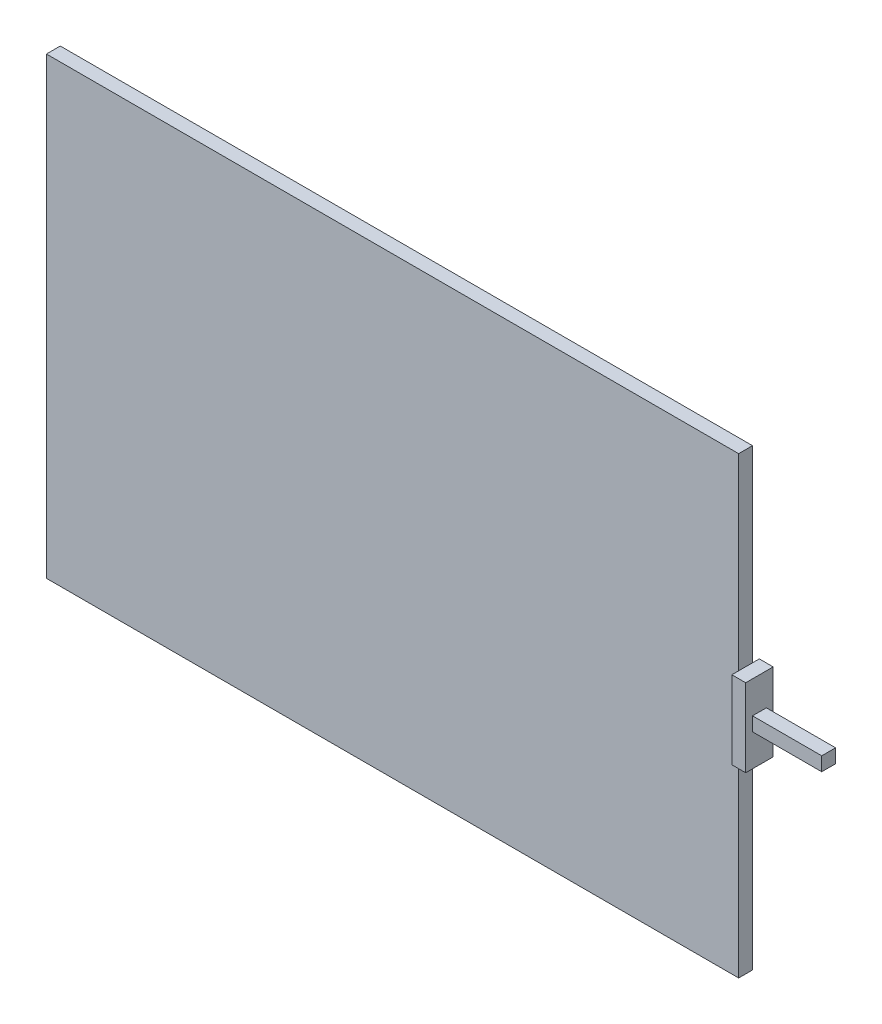
ISO-10303-21;
HEADER;
FILE_DESCRIPTION(('STEP AP214'),'2;1');
FILE_NAME('part.step','',(''),(''),'','','');
FILE_SCHEMA(('AUTOMOTIVE_DESIGN { 1 0 10303 214 1 1 1 1 }'));
ENDSEC;
DATA;
#1=APPLICATION_CONTEXT('core data for automotive mechanical design processes');
#2=APPLICATION_PROTOCOL_DEFINITION('international standard','automotive_design',2000,#1);
#3=PRODUCT_CONTEXT('',#1,'mechanical');
#4=PRODUCT('Part','Part','',(#3));
#5=PRODUCT_RELATED_PRODUCT_CATEGORY('part','',(#4));
#6=PRODUCT_DEFINITION_FORMATION('','',#4);
#7=PRODUCT_DEFINITION_CONTEXT('part definition',#1,'design');
#8=PRODUCT_DEFINITION('design','',#6,#7);
#9=PRODUCT_DEFINITION_SHAPE('','',#8);
#10=(LENGTH_UNIT() NAMED_UNIT(*) SI_UNIT(.MILLI.,.METRE.));
#11=(NAMED_UNIT(*) PLANE_ANGLE_UNIT() SI_UNIT($,.RADIAN.));
#12=(NAMED_UNIT(*) SI_UNIT($,.STERADIAN.) SOLID_ANGLE_UNIT());
#13=UNCERTAINTY_MEASURE_WITH_UNIT(LENGTH_MEASURE(1.E-05),#10,'distance_accuracy_value','');
#14=(GEOMETRIC_REPRESENTATION_CONTEXT(3) GLOBAL_UNCERTAINTY_ASSIGNED_CONTEXT((#13)) GLOBAL_UNIT_ASSIGNED_CONTEXT((#10,
#11,#12)) REPRESENTATION_CONTEXT('',''));
#15=CARTESIAN_POINT('',(0.,0.,0.));
#16=DIRECTION('',(0.,0.,1.));
#17=DIRECTION('',(1.,0.,0.));
#18=AXIS2_PLACEMENT_3D('',#15,#16,#17);
#19=CARTESIAN_POINT('',(50.0000000000003,32.7999999999999,2.));
#20=DIRECTION('',(1.,0.,0.));
#21=DIRECTION('',(0.,1.,0.));
#22=AXIS2_PLACEMENT_3D('',#19,#20,#21);
#23=PLANE('',#22);
#24=DIRECTION('',(0.,0.,-1.));
#25=VECTOR('',#24,1.);
#26=CARTESIAN_POINT('',(50.0000000000003,-5.63072724859682,2.98414402009177));
#27=LINE('',#26,#25);
#28=CARTESIAN_POINT('',(50.0000000000003,-5.63072724859681,2.));
#29=VERTEX_POINT('',#28);
#30=CARTESIAN_POINT('',(50.0000000000003,-5.63072724859681,0.));
#31=VERTEX_POINT('',#30);
#32=EDGE_CURVE('E11',#29,#31,#27,.T.);
#33=ORIENTED_EDGE('',*,*,#32,.F.);
#34=DIRECTION('',(0.,-1.,0.));
#35=VECTOR('',#34,1.);
#36=CARTESIAN_POINT('',(50.0000000000003,32.7999999999999,2.));
#37=LINE('',#36,#35);
#38=CARTESIAN_POINT('',(50.0000000000003,-32.7999999999999,2.));
#39=VERTEX_POINT('',#38);
#40=EDGE_CURVE('E201',#29,#39,#37,.T.);
#41=ORIENTED_EDGE('',*,*,#40,.T.);
#42=DIRECTION('',(0.,0.,-1.));
#43=VECTOR('',#42,1.);
#44=CARTESIAN_POINT('',(50.0000000000003,-32.7999999999999,2.));
#45=LINE('',#44,#43);
#46=CARTESIAN_POINT('',(50.0000000000003,-32.7999999999999,0.));
#47=VERTEX_POINT('',#46);
#48=EDGE_CURVE('E40',#39,#47,#45,.T.);
#49=ORIENTED_EDGE('',*,*,#48,.T.);
#50=DIRECTION('',(0.,-1.,0.));
#51=VECTOR('',#50,1.);
#52=CARTESIAN_POINT('',(50.0000000000003,32.7999999999999,0.));
#53=LINE('',#52,#51);
#54=EDGE_CURVE('E214',#31,#47,#53,.T.);
#55=ORIENTED_EDGE('',*,*,#54,.F.);
#56=EDGE_LOOP('',(#33,#41,#49,#55));
#57=FACE_BOUND('',#56,.T.);
#58=ADVANCED_FACE('F36',(#57),#23,.T.);
#59=CARTESIAN_POINT('',(-49.9999999999997,-32.7999999999999,2.));
#60=DIRECTION('',(0.,1.,0.));
#61=DIRECTION('',(0.,0.,1.));
#62=AXIS2_PLACEMENT_3D('',#59,#60,#61);
#63=PLANE('',#62);
#64=DIRECTION('',(1.,0.,0.));
#65=VECTOR('',#64,1.);
#66=CARTESIAN_POINT('',(-49.9999999999997,-32.7999999999999,0.));
#67=LINE('',#66,#65);
#68=CARTESIAN_POINT('',(-49.9999999999997,-32.7999999999999,0.));
#69=VERTEX_POINT('',#68);
#70=EDGE_CURVE('E197',#69,#47,#67,.T.);
#71=ORIENTED_EDGE('',*,*,#70,.T.);
#72=ORIENTED_EDGE('',*,*,#48,.F.);
#73=DIRECTION('',(1.,0.,0.));
#74=VECTOR('',#73,1.);
#75=CARTESIAN_POINT('',(-49.9999999999997,-32.7999999999999,2.));
#76=LINE('',#75,#74);
#77=CARTESIAN_POINT('',(-49.9999999999997,-32.7999999999999,2.));
#78=VERTEX_POINT('',#77);
#79=EDGE_CURVE('E198',#78,#39,#76,.T.);
#80=ORIENTED_EDGE('',*,*,#79,.F.);
#81=DIRECTION('',(0.,0.,-1.));
#82=VECTOR('',#81,1.);
#83=CARTESIAN_POINT('',(-49.9999999999997,-32.7999999999999,2.));
#84=LINE('',#83,#82);
#85=EDGE_CURVE('E211',#78,#69,#84,.T.);
#86=ORIENTED_EDGE('',*,*,#85,.T.);
#87=EDGE_LOOP('',(#71,#72,#80,#86));
#88=FACE_BOUND('',#87,.T.);
#89=ADVANCED_FACE('F38',(#88),#63,.F.);
#90=DIRECTION('',(0.,0.,1.));
#91=VECTOR('',#90,1.);
#92=CARTESIAN_POINT('',(50.0000000000003,5.63072724859684,2.98414402009177));
#93=LINE('',#92,#91);
#94=CARTESIAN_POINT('',(50.0000000000003,5.63072724859685,0.));
#95=VERTEX_POINT('',#94);
#96=CARTESIAN_POINT('',(50.0000000000003,5.63072724859684,2.));
#97=VERTEX_POINT('',#96);
#98=EDGE_CURVE('E45',#95,#97,#93,.T.);
#99=ORIENTED_EDGE('',*,*,#98,.F.);
#100=CARTESIAN_POINT('',(50.0000000000003,32.7999999999999,0.));
#101=VERTEX_POINT('',#100);
#102=EDGE_CURVE('E215',#101,#95,#53,.T.);
#103=ORIENTED_EDGE('',*,*,#102,.F.);
#104=DIRECTION('',(0.,0.,-1.));
#105=VECTOR('',#104,1.);
#106=CARTESIAN_POINT('',(50.0000000000003,32.7999999999999,2.));
#107=LINE('',#106,#105);
#108=CARTESIAN_POINT('',(50.0000000000003,32.7999999999999,2.));
#109=VERTEX_POINT('',#108);
#110=EDGE_CURVE('E226',#109,#101,#107,.T.);
#111=ORIENTED_EDGE('',*,*,#110,.F.);
#112=EDGE_CURVE('E203',#109,#97,#37,.T.);
#113=ORIENTED_EDGE('',*,*,#112,.T.);
#114=EDGE_LOOP('',(#99,#103,#111,#113));
#115=FACE_BOUND('',#114,.T.);
#116=ADVANCED_FACE('F281',(#115),#23,.T.);
#117=CARTESIAN_POINT('',(-49.9999999999997,32.7999999999999,2.));
#118=DIRECTION('',(0.,1.,0.));
#119=DIRECTION('',(0.,0.,1.));
#120=AXIS2_PLACEMENT_3D('',#117,#118,#119);
#121=PLANE('',#120);
#122=DIRECTION('',(1.,0.,0.));
#123=VECTOR('',#122,1.);
#124=CARTESIAN_POINT('',(-49.9999999999997,32.7999999999999,0.));
#125=LINE('',#124,#123);
#126=CARTESIAN_POINT('',(-49.9999999999997,32.7999999999999,0.));
#127=VERTEX_POINT('',#126);
#128=EDGE_CURVE('E218',#127,#101,#125,.T.);
#129=ORIENTED_EDGE('',*,*,#128,.F.);
#130=DIRECTION('',(0.,0.,-1.));
#131=VECTOR('',#130,1.);
#132=CARTESIAN_POINT('',(-49.9999999999997,32.7999999999999,2.));
#133=LINE('',#132,#131);
#134=CARTESIAN_POINT('',(-49.9999999999997,32.7999999999999,2.));
#135=VERTEX_POINT('',#134);
#136=EDGE_CURVE('E225',#135,#127,#133,.T.);
#137=ORIENTED_EDGE('',*,*,#136,.F.);
#138=DIRECTION('',(1.,0.,0.));
#139=VECTOR('',#138,1.);
#140=CARTESIAN_POINT('',(-49.9999999999997,32.7999999999999,2.));
#141=LINE('',#140,#139);
#142=EDGE_CURVE('E205',#135,#109,#141,.T.);
#143=ORIENTED_EDGE('',*,*,#142,.T.);
#144=ORIENTED_EDGE('',*,*,#110,.T.);
#145=EDGE_LOOP('',(#129,#137,#143,#144));
#146=FACE_BOUND('',#145,.T.);
#147=ADVANCED_FACE('F279',(#146),#121,.T.);
#148=CARTESIAN_POINT('',(-49.9999999999997,32.7999999999999,2.));
#149=DIRECTION('',(1.,0.,0.));
#150=DIRECTION('',(0.,1.,0.));
#151=AXIS2_PLACEMENT_3D('',#148,#149,#150);
#152=PLANE('',#151);
#153=DIRECTION('',(0.,-1.,0.));
#154=VECTOR('',#153,1.);
#155=CARTESIAN_POINT('',(-49.9999999999997,32.7999999999999,0.));
#156=LINE('',#155,#154);
#157=EDGE_CURVE('E202',#127,#69,#156,.T.);
#158=ORIENTED_EDGE('',*,*,#157,.T.);
#159=ORIENTED_EDGE('',*,*,#85,.F.);
#160=DIRECTION('',(0.,-1.,0.));
#161=VECTOR('',#160,1.);
#162=CARTESIAN_POINT('',(-49.9999999999997,32.7999999999999,2.));
#163=LINE('',#162,#161);
#164=EDGE_CURVE('E209',#135,#78,#163,.T.);
#165=ORIENTED_EDGE('',*,*,#164,.F.);
#166=ORIENTED_EDGE('',*,*,#136,.T.);
#167=EDGE_LOOP('',(#158,#159,#165,#166));
#168=FACE_BOUND('',#167,.T.);
#169=ADVANCED_FACE('F278',(#168),#152,.F.);
#170=CARTESIAN_POINT('',(0.,0.,2.));
#171=DIRECTION('',(0.,0.,-1.));
#172=DIRECTION('',(-1.,0.,0.));
#173=AXIS2_PLACEMENT_3D('',#170,#171,#172);
#174=PLANE('',#173);
#175=ORIENTED_EDGE('',*,*,#79,.T.);
#176=ORIENTED_EDGE('',*,*,#40,.F.);
#177=EDGE_CURVE('E206',#97,#29,#37,.T.);
#178=ORIENTED_EDGE('',*,*,#177,.F.);
#179=ORIENTED_EDGE('',*,*,#112,.F.);
#180=ORIENTED_EDGE('',*,*,#142,.F.);
#181=ORIENTED_EDGE('',*,*,#164,.T.);
#182=EDGE_LOOP('',(#175,#176,#178,#179,#180,#181));
#183=FACE_BOUND('',#182,.T.);
#184=ADVANCED_FACE('F270',(#183),#174,.F.);
#185=CARTESIAN_POINT('',(0.,0.,0.));
#186=DIRECTION('',(0.,0.,-1.));
#187=DIRECTION('',(-1.,0.,0.));
#188=AXIS2_PLACEMENT_3D('',#185,#186,#187);
#189=PLANE('',#188);
#190=ORIENTED_EDGE('',*,*,#70,.F.);
#191=ORIENTED_EDGE('',*,*,#157,.F.);
#192=ORIENTED_EDGE('',*,*,#128,.T.);
#193=ORIENTED_EDGE('',*,*,#102,.T.);
#194=EDGE_CURVE('E219',#95,#31,#53,.T.);
#195=ORIENTED_EDGE('',*,*,#194,.T.);
#196=ORIENTED_EDGE('',*,*,#54,.T.);
#197=EDGE_LOOP('',(#190,#191,#192,#193,#195,#196));
#198=FACE_BOUND('',#197,.T.);
#199=ADVANCED_FACE('F266',(#198),#189,.T.);
#200=CARTESIAN_POINT('',(50.0000000000003,0.,0.));
#201=DIRECTION('',(1.,0.,0.));
#202=DIRECTION('',(0.,0.,-1.));
#203=AXIS2_PLACEMENT_3D('',#200,#201,#202);
#204=PLANE('',#203);
#205=CARTESIAN_POINT('',(50.0000000000003,5.63072724859684,2.98414402009177));
#206=VERTEX_POINT('',#205);
#207=EDGE_CURVE('E164',#97,#206,#93,.T.);
#208=ORIENTED_EDGE('',*,*,#207,.F.);
#209=ORIENTED_EDGE('',*,*,#177,.T.);
#210=CARTESIAN_POINT('',(50.0000000000003,-5.63072724859682,2.98414402009177));
#211=VERTEX_POINT('',#210);
#212=EDGE_CURVE('E47',#211,#29,#27,.T.);
#213=ORIENTED_EDGE('',*,*,#212,.F.);
#214=DIRECTION('',(0.,-1.,0.));
#215=VECTOR('',#214,1.);
#216=CARTESIAN_POINT('',(50.0000000000003,5.63072724859684,2.98414402009177));
#217=LINE('',#216,#215);
#218=EDGE_CURVE('E183',#206,#211,#217,.T.);
#219=ORIENTED_EDGE('',*,*,#218,.F.);
#220=EDGE_LOOP('',(#208,#209,#213,#219));
#221=FACE_BOUND('',#220,.T.);
#222=ADVANCED_FACE('F246',(#221),#204,.F.);
#223=CARTESIAN_POINT('',(52.0000000000003,5.63072724859684,-0.984144020091771));
#224=DIRECTION('',(0.,0.,1.));
#225=DIRECTION('',(1.,0.,0.));
#226=AXIS2_PLACEMENT_3D('',#223,#224,#225);
#227=PLANE('',#226);
#228=DIRECTION('',(0.,1.,0.));
#229=VECTOR('',#228,1.);
#230=CARTESIAN_POINT('',(50.0000000000003,5.63072724859684,-0.984144020091771));
#231=LINE('',#230,#229);
#232=CARTESIAN_POINT('',(50.0000000000003,-5.63072724859682,-0.984144020091771));
#233=VERTEX_POINT('',#232);
#234=CARTESIAN_POINT('',(50.0000000000003,5.63072724859684,-0.984144020091771));
#235=VERTEX_POINT('',#234);
#236=EDGE_CURVE('E161',#233,#235,#231,.T.);
#237=ORIENTED_EDGE('',*,*,#236,.T.);
#238=DIRECTION('',(-1.,0.,0.));
#239=VECTOR('',#238,1.);
#240=CARTESIAN_POINT('',(52.0000000000003,5.63072724859684,-0.984144020091771));
#241=LINE('',#240,#239);
#242=CARTESIAN_POINT('',(52.0000000000003,5.63072724859684,-0.984144020091771));
#243=VERTEX_POINT('',#242);
#244=EDGE_CURVE('E194',#243,#235,#241,.T.);
#245=ORIENTED_EDGE('',*,*,#244,.F.);
#246=DIRECTION('',(0.,1.,0.));
#247=VECTOR('',#246,1.);
#248=CARTESIAN_POINT('',(52.0000000000003,5.63072724859684,-0.984144020091771));
#249=LINE('',#248,#247);
#250=CARTESIAN_POINT('',(52.0000000000003,-5.63072724859682,-0.984144020091771));
#251=VERTEX_POINT('',#250);
#252=EDGE_CURVE('E170',#251,#243,#249,.T.);
#253=ORIENTED_EDGE('',*,*,#252,.F.);
#254=DIRECTION('',(-1.,0.,0.));
#255=VECTOR('',#254,1.);
#256=CARTESIAN_POINT('',(52.0000000000003,-5.63072724859682,-0.984144020091771));
#257=LINE('',#256,#255);
#258=EDGE_CURVE('E178',#251,#233,#257,.T.);
#259=ORIENTED_EDGE('',*,*,#258,.T.);
#260=EDGE_LOOP('',(#237,#245,#253,#259));
#261=FACE_BOUND('',#260,.T.);
#262=ADVANCED_FACE('F258',(#261),#227,.F.);
#263=CARTESIAN_POINT('',(52.0000000000003,5.63072724859684,2.98414402009177));
#264=DIRECTION('',(0.,-1.,0.));
#265=DIRECTION('',(1.,0.,0.));
#266=AXIS2_PLACEMENT_3D('',#263,#264,#265);
#267=PLANE('',#266);
#268=EDGE_CURVE('E180',#235,#95,#93,.T.);
#269=ORIENTED_EDGE('',*,*,#268,.T.);
#270=ORIENTED_EDGE('',*,*,#98,.T.);
#271=ORIENTED_EDGE('',*,*,#207,.T.);
#272=DIRECTION('',(-1.,0.,0.));
#273=VECTOR('',#272,1.);
#274=CARTESIAN_POINT('',(52.0000000000003,5.63072724859684,2.98414402009177));
#275=LINE('',#274,#273);
#276=CARTESIAN_POINT('',(52.0000000000003,5.63072724859684,2.98414402009177));
#277=VERTEX_POINT('',#276);
#278=EDGE_CURVE('E191',#277,#206,#275,.T.);
#279=ORIENTED_EDGE('',*,*,#278,.F.);
#280=DIRECTION('',(0.,0.,1.));
#281=VECTOR('',#280,1.);
#282=CARTESIAN_POINT('',(52.0000000000003,5.63072724859684,2.98414402009177));
#283=LINE('',#282,#281);
#284=EDGE_CURVE('E173',#243,#277,#283,.T.);
#285=ORIENTED_EDGE('',*,*,#284,.F.);
#286=ORIENTED_EDGE('',*,*,#244,.T.);
#287=EDGE_LOOP('',(#269,#270,#271,#279,#285,#286));
#288=FACE_BOUND('',#287,.T.);
#289=ADVANCED_FACE('F237',(#288),#267,.F.);
#290=CARTESIAN_POINT('',(52.0000000000003,5.63072724859684,2.98414402009177));
#291=DIRECTION('',(0.,0.,-1.));
#292=DIRECTION('',(-1.,0.,0.));
#293=AXIS2_PLACEMENT_3D('',#290,#291,#292);
#294=PLANE('',#293);
#295=ORIENTED_EDGE('',*,*,#218,.T.);
#296=DIRECTION('',(-1.,0.,0.));
#297=VECTOR('',#296,1.);
#298=CARTESIAN_POINT('',(52.0000000000003,-5.63072724859682,2.98414402009177));
#299=LINE('',#298,#297);
#300=CARTESIAN_POINT('',(52.0000000000003,-5.63072724859682,2.98414402009177));
#301=VERTEX_POINT('',#300);
#302=EDGE_CURVE('E188',#301,#211,#299,.T.);
#303=ORIENTED_EDGE('',*,*,#302,.F.);
#304=DIRECTION('',(0.,-1.,0.));
#305=VECTOR('',#304,1.);
#306=CARTESIAN_POINT('',(52.0000000000003,5.63072724859684,2.98414402009177));
#307=LINE('',#306,#305);
#308=EDGE_CURVE('E175',#277,#301,#307,.T.);
#309=ORIENTED_EDGE('',*,*,#308,.F.);
#310=ORIENTED_EDGE('',*,*,#278,.T.);
#311=EDGE_LOOP('',(#295,#303,#309,#310));
#312=FACE_BOUND('',#311,.T.);
#313=ADVANCED_FACE('F243',(#312),#294,.F.);
#314=CARTESIAN_POINT('',(52.0000000000003,-5.63072724859682,2.98414402009177));
#315=DIRECTION('',(0.,1.,0.));
#316=DIRECTION('',(-1.,0.,0.));
#317=AXIS2_PLACEMENT_3D('',#314,#315,#316);
#318=PLANE('',#317);
#319=ORIENTED_EDGE('',*,*,#212,.T.);
#320=ORIENTED_EDGE('',*,*,#32,.T.);
#321=EDGE_CURVE('E48',#31,#233,#27,.T.);
#322=ORIENTED_EDGE('',*,*,#321,.T.);
#323=ORIENTED_EDGE('',*,*,#258,.F.);
#324=DIRECTION('',(0.,0.,-1.));
#325=VECTOR('',#324,1.);
#326=CARTESIAN_POINT('',(52.0000000000003,-5.63072724859682,2.98414402009177));
#327=LINE('',#326,#325);
#328=EDGE_CURVE('E177',#301,#251,#327,.T.);
#329=ORIENTED_EDGE('',*,*,#328,.F.);
#330=ORIENTED_EDGE('',*,*,#302,.T.);
#331=EDGE_LOOP('',(#319,#320,#322,#323,#329,#330));
#332=FACE_BOUND('',#331,.T.);
#333=ADVANCED_FACE('F249',(#332),#318,.F.);
#334=CARTESIAN_POINT('',(52.0000000000003,0.,0.));
#335=DIRECTION('',(1.,0.,0.));
#336=DIRECTION('',(0.,0.,-1.));
#337=AXIS2_PLACEMENT_3D('',#334,#335,#336);
#338=PLANE('',#337);
#339=DIRECTION('',(0.,1.,0.));
#340=VECTOR('',#339,1.);
#341=CARTESIAN_POINT('',(52.0000000000003,1.,0.));
#342=LINE('',#341,#340);
#343=CARTESIAN_POINT('',(52.0000000000003,-1.,0.));
#344=VERTEX_POINT('',#343);
#345=CARTESIAN_POINT('',(52.0000000000003,1.,0.));
#346=VERTEX_POINT('',#345);
#347=EDGE_CURVE('E55',#344,#346,#342,.T.);
#348=ORIENTED_EDGE('',*,*,#347,.F.);
#349=DIRECTION('',(0.,0.,-1.));
#350=VECTOR('',#349,1.);
#351=CARTESIAN_POINT('',(52.0000000000003,-1.,2.));
#352=LINE('',#351,#350);
#353=CARTESIAN_POINT('',(52.0000000000003,-1.,2.));
#354=VERTEX_POINT('',#353);
#355=EDGE_CURVE('E59',#354,#344,#352,.T.);
#356=ORIENTED_EDGE('',*,*,#355,.F.);
#357=DIRECTION('',(0.,-1.,0.));
#358=VECTOR('',#357,1.);
#359=CARTESIAN_POINT('',(52.0000000000003,1.,2.));
#360=LINE('',#359,#358);
#361=CARTESIAN_POINT('',(52.0000000000003,1.,2.));
#362=VERTEX_POINT('',#361);
#363=EDGE_CURVE('E434',#362,#354,#360,.T.);
#364=ORIENTED_EDGE('',*,*,#363,.F.);
#365=DIRECTION('',(0.,0.,1.));
#366=VECTOR('',#365,1.);
#367=CARTESIAN_POINT('',(52.0000000000003,1.,2.));
#368=LINE('',#367,#366);
#369=EDGE_CURVE('E440',#346,#362,#368,.T.);
#370=ORIENTED_EDGE('',*,*,#369,.F.);
#371=EDGE_LOOP('',(#348,#356,#364,#370));
#372=FACE_BOUND('',#371,.T.);
#373=ORIENTED_EDGE('',*,*,#252,.T.);
#374=ORIENTED_EDGE('',*,*,#284,.T.);
#375=ORIENTED_EDGE('',*,*,#308,.T.);
#376=ORIENTED_EDGE('',*,*,#328,.T.);
#377=EDGE_LOOP('',(#373,#374,#375,#376));
#378=FACE_BOUND('',#377,.T.);
#379=ADVANCED_FACE('F254',(#372,#378),#338,.T.);
#380=ORIENTED_EDGE('',*,*,#194,.F.);
#381=ORIENTED_EDGE('',*,*,#268,.F.);
#382=ORIENTED_EDGE('',*,*,#236,.F.);
#383=ORIENTED_EDGE('',*,*,#321,.F.);
#384=EDGE_LOOP('',(#380,#381,#382,#383));
#385=FACE_BOUND('',#384,.T.);
#386=ADVANCED_FACE('F262',(#385),#204,.F.);
#387=CARTESIAN_POINT('',(62.0000000000003,1.,0.));
#388=DIRECTION('',(0.,0.,1.));
#389=DIRECTION('',(0.,-1.,0.));
#390=AXIS2_PLACEMENT_3D('',#387,#388,#389);
#391=PLANE('',#390);
#392=ORIENTED_EDGE('',*,*,#347,.T.);
#393=DIRECTION('',(-1.,0.,0.));
#394=VECTOR('',#393,1.);
#395=CARTESIAN_POINT('',(62.0000000000003,1.,0.));
#396=LINE('',#395,#394);
#397=CARTESIAN_POINT('',(62.0000000000003,1.,0.));
#398=VERTEX_POINT('',#397);
#399=EDGE_CURVE('E144',#398,#346,#396,.T.);
#400=ORIENTED_EDGE('',*,*,#399,.F.);
#401=DIRECTION('',(0.,1.,0.));
#402=VECTOR('',#401,1.);
#403=CARTESIAN_POINT('',(62.0000000000003,1.,0.));
#404=LINE('',#403,#402);
#405=CARTESIAN_POINT('',(62.0000000000003,-1.,0.));
#406=VERTEX_POINT('',#405);
#407=EDGE_CURVE('E150',#406,#398,#404,.T.);
#408=ORIENTED_EDGE('',*,*,#407,.F.);
#409=DIRECTION('',(-1.,0.,0.));
#410=VECTOR('',#409,1.);
#411=CARTESIAN_POINT('',(62.0000000000003,-1.,0.));
#412=LINE('',#411,#410);
#413=EDGE_CURVE('E432',#406,#344,#412,.T.);
#414=ORIENTED_EDGE('',*,*,#413,.T.);
#415=EDGE_LOOP('',(#392,#400,#408,#414));
#416=FACE_BOUND('',#415,.T.);
#417=ADVANCED_FACE('F160',(#416),#391,.F.);
#418=CARTESIAN_POINT('',(62.0000000000003,1.,2.));
#419=DIRECTION('',(0.,-1.,0.));
#420=DIRECTION('',(0.,0.,-1.));
#421=AXIS2_PLACEMENT_3D('',#418,#419,#420);
#422=PLANE('',#421);
#423=ORIENTED_EDGE('',*,*,#369,.T.);
#424=DIRECTION('',(-1.,0.,0.));
#425=VECTOR('',#424,1.);
#426=CARTESIAN_POINT('',(62.0000000000003,1.,2.));
#427=LINE('',#426,#425);
#428=CARTESIAN_POINT('',(62.0000000000003,1.,2.));
#429=VERTEX_POINT('',#428);
#430=EDGE_CURVE('E146',#429,#362,#427,.T.);
#431=ORIENTED_EDGE('',*,*,#430,.F.);
#432=DIRECTION('',(0.,0.,1.));
#433=VECTOR('',#432,1.);
#434=CARTESIAN_POINT('',(62.0000000000003,1.,2.));
#435=LINE('',#434,#433);
#436=EDGE_CURVE('E139',#398,#429,#435,.T.);
#437=ORIENTED_EDGE('',*,*,#436,.F.);
#438=ORIENTED_EDGE('',*,*,#399,.T.);
#439=EDGE_LOOP('',(#423,#431,#437,#438));
#440=FACE_BOUND('',#439,.T.);
#441=ADVANCED_FACE('F142',(#440),#422,.F.);
#442=CARTESIAN_POINT('',(62.0000000000003,1.,2.));
#443=DIRECTION('',(0.,0.,-1.));
#444=DIRECTION('',(0.,1.,0.));
#445=AXIS2_PLACEMENT_3D('',#442,#443,#444);
#446=PLANE('',#445);
#447=ORIENTED_EDGE('',*,*,#363,.T.);
#448=DIRECTION('',(-1.,0.,0.));
#449=VECTOR('',#448,1.);
#450=CARTESIAN_POINT('',(62.0000000000003,-1.,2.));
#451=LINE('',#450,#449);
#452=CARTESIAN_POINT('',(62.0000000000003,-1.,2.));
#453=VERTEX_POINT('',#452);
#454=EDGE_CURVE('E166',#453,#354,#451,.T.);
#455=ORIENTED_EDGE('',*,*,#454,.F.);
#456=DIRECTION('',(0.,-1.,0.));
#457=VECTOR('',#456,1.);
#458=CARTESIAN_POINT('',(62.0000000000003,1.,2.));
#459=LINE('',#458,#457);
#460=EDGE_CURVE('E149',#429,#453,#459,.T.);
#461=ORIENTED_EDGE('',*,*,#460,.F.);
#462=ORIENTED_EDGE('',*,*,#430,.T.);
#463=EDGE_LOOP('',(#447,#455,#461,#462));
#464=FACE_BOUND('',#463,.T.);
#465=ADVANCED_FACE('F377',(#464),#446,.F.);
#466=CARTESIAN_POINT('',(62.0000000000003,-1.,2.));
#467=DIRECTION('',(0.,1.,0.));
#468=DIRECTION('',(0.,0.,1.));
#469=AXIS2_PLACEMENT_3D('',#466,#467,#468);
#470=PLANE('',#469);
#471=ORIENTED_EDGE('',*,*,#355,.T.);
#472=ORIENTED_EDGE('',*,*,#413,.F.);
#473=DIRECTION('',(0.,0.,-1.));
#474=VECTOR('',#473,1.);
#475=CARTESIAN_POINT('',(62.0000000000003,-1.,2.));
#476=LINE('',#475,#474);
#477=EDGE_CURVE('E155',#453,#406,#476,.T.);
#478=ORIENTED_EDGE('',*,*,#477,.F.);
#479=ORIENTED_EDGE('',*,*,#454,.T.);
#480=EDGE_LOOP('',(#471,#472,#478,#479));
#481=FACE_BOUND('',#480,.T.);
#482=ADVANCED_FACE('F384',(#481),#470,.F.);
#483=CARTESIAN_POINT('',(62.0000000000003,0.,0.));
#484=DIRECTION('',(1.,0.,0.));
#485=DIRECTION('',(0.,0.,-1.));
#486=AXIS2_PLACEMENT_3D('',#483,#484,#485);
#487=PLANE('',#486);
#488=ORIENTED_EDGE('',*,*,#407,.T.);
#489=ORIENTED_EDGE('',*,*,#436,.T.);
#490=ORIENTED_EDGE('',*,*,#460,.T.);
#491=ORIENTED_EDGE('',*,*,#477,.T.);
#492=EDGE_LOOP('',(#488,#489,#490,#491));
#493=FACE_BOUND('',#492,.T.);
#494=ADVANCED_FACE('F153',(#493),#487,.T.);
#495=CLOSED_SHELL('',(#58,#89,#116,#147,#169,#184,#199,#222,#262,#289,#313,#333,#379,#386,#417,
#441,#465,#482,#494));
#496=MANIFOLD_SOLID_BREP('B2',#495);
#497=ADVANCED_BREP_SHAPE_REPRESENTATION('',(#18,#496),#14);
#498=SHAPE_DEFINITION_REPRESENTATION(#9,#497);
ENDSEC;
END-ISO-10303-21;
